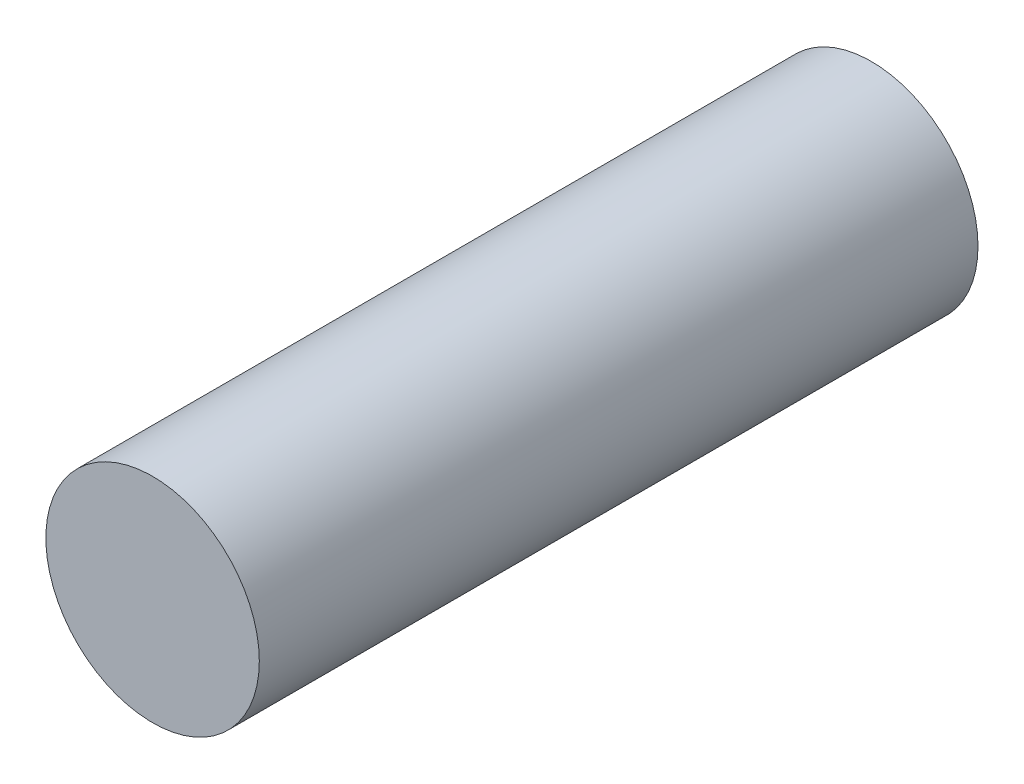
ISO-10303-21;
HEADER;
FILE_DESCRIPTION(('STEP AP214'),'2;1');
FILE_NAME('part.step','',(''),(''),'','','');
FILE_SCHEMA(('AUTOMOTIVE_DESIGN { 1 0 10303 214 1 1 1 1 }'));
ENDSEC;
DATA;
#1=APPLICATION_CONTEXT('core data for automotive mechanical design processes');
#2=APPLICATION_PROTOCOL_DEFINITION('international standard','automotive_design',2000,#1);
#3=PRODUCT_CONTEXT('',#1,'mechanical');
#4=PRODUCT('Part','Part','',(#3));
#5=PRODUCT_RELATED_PRODUCT_CATEGORY('part','',(#4));
#6=PRODUCT_DEFINITION_FORMATION('','',#4);
#7=PRODUCT_DEFINITION_CONTEXT('part definition',#1,'design');
#8=PRODUCT_DEFINITION('design','',#6,#7);
#9=PRODUCT_DEFINITION_SHAPE('','',#8);
#10=(LENGTH_UNIT() NAMED_UNIT(*) SI_UNIT(.MILLI.,.METRE.));
#11=(NAMED_UNIT(*) PLANE_ANGLE_UNIT() SI_UNIT($,.RADIAN.));
#12=(NAMED_UNIT(*) SI_UNIT($,.STERADIAN.) SOLID_ANGLE_UNIT());
#13=UNCERTAINTY_MEASURE_WITH_UNIT(LENGTH_MEASURE(1.E-05),#10,'distance_accuracy_value','');
#14=(GEOMETRIC_REPRESENTATION_CONTEXT(3) GLOBAL_UNCERTAINTY_ASSIGNED_CONTEXT((#13)) GLOBAL_UNIT_ASSIGNED_CONTEXT((#10,
#11,#12)) REPRESENTATION_CONTEXT('',''));
#15=CARTESIAN_POINT('',(0.,0.,0.));
#16=DIRECTION('',(0.,0.,1.));
#17=DIRECTION('',(1.,0.,0.));
#18=AXIS2_PLACEMENT_3D('',#15,#16,#17);
#19=CARTESIAN_POINT('',(0.,0.,51.308));
#20=DIRECTION('',(0.,0.,-1.));
#21=DIRECTION('',(-1.,0.,0.));
#22=AXIS2_PLACEMENT_3D('',#19,#20,#21);
#23=CYLINDRICAL_SURFACE('',#22,7.62);
#24=CARTESIAN_POINT('',(0.,0.,51.308));
#25=DIRECTION('',(0.,0.,1.));
#26=DIRECTION('',(1.,0.,0.));
#27=AXIS2_PLACEMENT_3D('',#24,#25,#26);
#28=CIRCLE('',#27,7.62);
#29=CARTESIAN_POINT('',(7.62,0.,51.308));
#30=VERTEX_POINT('',#29);
#31=EDGE_CURVE('E10',#30,#30,#28,.T.);
#32=ORIENTED_EDGE('',*,*,#31,.F.);
#33=EDGE_LOOP('',(#32));
#34=FACE_BOUND('',#33,.T.);
#35=CARTESIAN_POINT('',(0.,0.,0.));
#36=DIRECTION('',(0.,0.,1.));
#37=DIRECTION('',(1.,0.,0.));
#38=AXIS2_PLACEMENT_3D('',#35,#36,#37);
#39=CIRCLE('',#38,7.62);
#40=CARTESIAN_POINT('',(7.62,0.,0.));
#41=VERTEX_POINT('',#40);
#42=EDGE_CURVE('E34',#41,#41,#39,.T.);
#43=ORIENTED_EDGE('',*,*,#42,.T.);
#44=EDGE_LOOP('',(#43));
#45=FACE_BOUND('',#44,.T.);
#46=ADVANCED_FACE('F31',(#34,#45),#23,.T.);
#47=CARTESIAN_POINT('',(0.,0.,51.308));
#48=DIRECTION('',(0.,0.,1.));
#49=DIRECTION('',(1.,0.,0.));
#50=AXIS2_PLACEMENT_3D('',#47,#48,#49);
#51=PLANE('',#50);
#52=ORIENTED_EDGE('',*,*,#31,.T.);
#53=EDGE_LOOP('',(#52));
#54=FACE_BOUND('',#53,.T.);
#55=ADVANCED_FACE('F46',(#54),#51,.T.);
#56=CARTESIAN_POINT('',(0.,0.,0.));
#57=DIRECTION('',(0.,0.,1.));
#58=DIRECTION('',(1.,0.,0.));
#59=AXIS2_PLACEMENT_3D('',#56,#57,#58);
#60=PLANE('',#59);
#61=ORIENTED_EDGE('',*,*,#42,.F.);
#62=EDGE_LOOP('',(#61));
#63=FACE_BOUND('',#62,.T.);
#64=ADVANCED_FACE('F44',(#63),#60,.F.);
#65=CLOSED_SHELL('',(#46,#55,#64));
#66=MANIFOLD_SOLID_BREP('B2',#65);
#67=ADVANCED_BREP_SHAPE_REPRESENTATION('',(#18,#66),#14);
#68=SHAPE_DEFINITION_REPRESENTATION(#9,#67);
ENDSEC;
END-ISO-10303-21;
